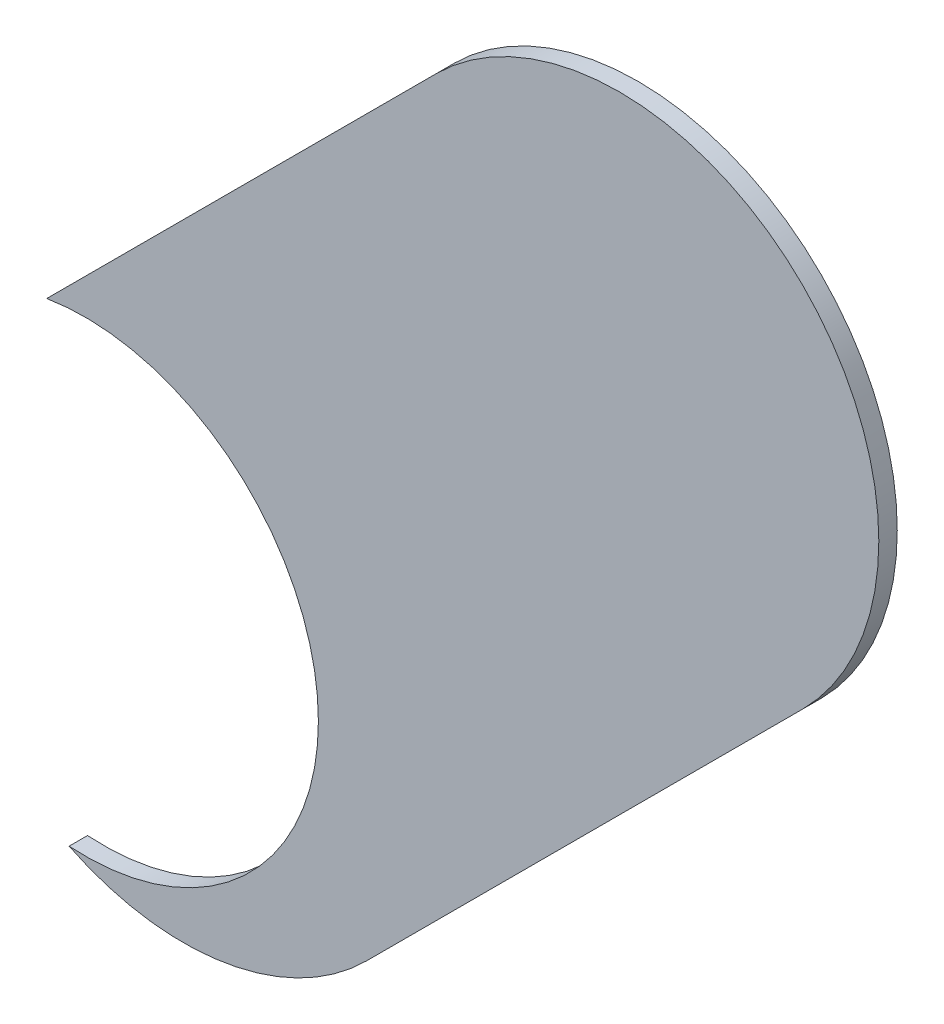
ISO-10303-21;
HEADER;
FILE_DESCRIPTION(('STEP AP214'),'2;1');
FILE_NAME('part.step','',(''),(''),'','','');
FILE_SCHEMA(('AUTOMOTIVE_DESIGN { 1 0 10303 214 1 1 1 1 }'));
ENDSEC;
DATA;
#1=APPLICATION_CONTEXT('core data for automotive mechanical design processes');
#2=APPLICATION_PROTOCOL_DEFINITION('international standard','automotive_design',2000,#1);
#3=PRODUCT_CONTEXT('',#1,'mechanical');
#4=PRODUCT('Part','Part','',(#3));
#5=PRODUCT_RELATED_PRODUCT_CATEGORY('part','',(#4));
#6=PRODUCT_DEFINITION_FORMATION('','',#4);
#7=PRODUCT_DEFINITION_CONTEXT('part definition',#1,'design');
#8=PRODUCT_DEFINITION('design','',#6,#7);
#9=PRODUCT_DEFINITION_SHAPE('','',#8);
#10=(LENGTH_UNIT() NAMED_UNIT(*) SI_UNIT(.MILLI.,.METRE.));
#11=(NAMED_UNIT(*) PLANE_ANGLE_UNIT() SI_UNIT($,.RADIAN.));
#12=(NAMED_UNIT(*) SI_UNIT($,.STERADIAN.) SOLID_ANGLE_UNIT());
#13=UNCERTAINTY_MEASURE_WITH_UNIT(LENGTH_MEASURE(1.E-05),#10,'distance_accuracy_value','');
#14=(GEOMETRIC_REPRESENTATION_CONTEXT(3) GLOBAL_UNCERTAINTY_ASSIGNED_CONTEXT((#13)) GLOBAL_UNIT_ASSIGNED_CONTEXT((#10,
#11,#12)) REPRESENTATION_CONTEXT('',''));
#15=CARTESIAN_POINT('',(0.,0.,0.));
#16=DIRECTION('',(0.,0.,1.));
#17=DIRECTION('',(1.,0.,0.));
#18=AXIS2_PLACEMENT_3D('',#15,#16,#17);
#19=CARTESIAN_POINT('',(80.44298872,79.80645964,0.));
#20=DIRECTION('',(-0.70710678118656,0.707106781186536,0.));
#21=DIRECTION('',(0.707106781186536,0.70710678118656,0.));
#22=AXIS2_PLACEMENT_3D('',#19,#20,#21);
#23=PLANE('',#22);
#24=DIRECTION('',(0.707106781186536,0.70710678118656,0.));
#25=VECTOR('',#24,1.);
#26=CARTESIAN_POINT('',(80.44298872,79.80645964,0.03556));
#27=LINE('',#26,#25);
#28=CARTESIAN_POINT('',(80.44298872,79.80645964,0.03556));
#29=VERTEX_POINT('',#28);
#30=CARTESIAN_POINT('',(81.28403352,80.64750444,0.03556));
#31=VERTEX_POINT('',#30);
#32=EDGE_CURVE('E11',#29,#31,#27,.T.);
#33=ORIENTED_EDGE('',*,*,#32,.F.);
#34=DIRECTION('',(0.,0.,1.));
#35=VECTOR('',#34,1.);
#36=CARTESIAN_POINT('',(80.44298872,79.80645964,0.));
#37=LINE('',#36,#35);
#38=CARTESIAN_POINT('',(80.44298872,79.80645964,0.));
#39=VERTEX_POINT('',#38);
#40=EDGE_CURVE('E24',#39,#29,#37,.T.);
#41=ORIENTED_EDGE('',*,*,#40,.F.);
#42=DIRECTION('',(0.707106781186536,0.70710678118656,0.));
#43=VECTOR('',#42,1.);
#44=CARTESIAN_POINT('',(80.44298872,79.80645964,0.));
#45=LINE('',#44,#43);
#46=CARTESIAN_POINT('',(81.28403352,80.64750444,0.));
#47=VERTEX_POINT('',#46);
#48=EDGE_CURVE('E89',#39,#47,#45,.T.);
#49=ORIENTED_EDGE('',*,*,#48,.T.);
#50=DIRECTION('',(0.,0.,1.));
#51=VECTOR('',#50,1.);
#52=CARTESIAN_POINT('',(81.28403352,80.64750444,0.));
#53=LINE('',#52,#51);
#54=EDGE_CURVE('E37',#47,#31,#53,.T.);
#55=ORIENTED_EDGE('',*,*,#54,.T.);
#56=EDGE_LOOP('',(#33,#41,#49,#55));
#57=FACE_BOUND('',#56,.T.);
#58=ADVANCED_FACE('F17',(#57),#23,.F.);
#59=CARTESIAN_POINT('',(80.93048076,81.0010572,0.));
#60=DIRECTION('',(0.,0.,-1.));
#61=DIRECTION('',(0.707106781186562,-0.707106781186533,0.));
#62=AXIS2_PLACEMENT_3D('',#59,#60,#61);
#63=CYLINDRICAL_SURFACE('',#62,0.499999108206436);
#64=CARTESIAN_POINT('',(80.93048076,81.0010572,0.03556));
#65=DIRECTION('',(0.,0.,1.));
#66=DIRECTION('',(0.707106781186562,-0.707106781186533,0.));
#67=AXIS2_PLACEMENT_3D('',#64,#65,#66);
#68=CIRCLE('',#67,0.499999108206436);
#69=CARTESIAN_POINT('',(80.576928,81.35460996,0.03556));
#70=VERTEX_POINT('',#69);
#71=EDGE_CURVE('E111',#31,#70,#68,.T.);
#72=ORIENTED_EDGE('',*,*,#71,.F.);
#73=ORIENTED_EDGE('',*,*,#54,.F.);
#74=CARTESIAN_POINT('',(80.93048076,81.0010572,0.));
#75=DIRECTION('',(0.,0.,1.));
#76=DIRECTION('',(0.707106781186562,-0.707106781186533,0.));
#77=AXIS2_PLACEMENT_3D('',#74,#75,#76);
#78=CIRCLE('',#77,0.499999108206436);
#79=CARTESIAN_POINT('',(80.576928,81.35460996,0.));
#80=VERTEX_POINT('',#79);
#81=EDGE_CURVE('E108',#47,#80,#78,.T.);
#82=ORIENTED_EDGE('',*,*,#81,.T.);
#83=DIRECTION('',(0.,0.,1.));
#84=VECTOR('',#83,1.);
#85=CARTESIAN_POINT('',(80.576928,81.35460996,0.));
#86=LINE('',#85,#84);
#87=EDGE_CURVE('E106',#80,#70,#86,.T.);
#88=ORIENTED_EDGE('',*,*,#87,.T.);
#89=EDGE_LOOP('',(#72,#73,#82,#88));
#90=FACE_BOUND('',#89,.T.);
#91=ADVANCED_FACE('F118',(#90),#63,.T.);
#92=CARTESIAN_POINT('',(80.576928,81.35460996,0.));
#93=DIRECTION('',(0.707106781186542,-0.707106781186554,0.));
#94=DIRECTION('',(-0.707106781186554,-0.707106781186542,0.));
#95=AXIS2_PLACEMENT_3D('',#92,#93,#94);
#96=PLANE('',#95);
#97=DIRECTION('',(-0.707106781186554,-0.707106781186542,0.));
#98=VECTOR('',#97,1.);
#99=CARTESIAN_POINT('',(80.576928,81.35460996,0.03556));
#100=LINE('',#99,#98);
#101=CARTESIAN_POINT('',(79.8262404042577,80.6039223642577,0.03556));
#102=VERTEX_POINT('',#101);
#103=EDGE_CURVE('E103',#70,#102,#100,.T.);
#104=ORIENTED_EDGE('',*,*,#103,.F.);
#105=ORIENTED_EDGE('',*,*,#87,.F.);
#106=DIRECTION('',(-0.707106781186554,-0.707106781186542,0.));
#107=VECTOR('',#106,1.);
#108=CARTESIAN_POINT('',(80.576928,81.35460996,0.));
#109=LINE('',#108,#107);
#110=CARTESIAN_POINT('',(79.8262404042577,80.6039223642577,0.));
#111=VERTEX_POINT('',#110);
#112=EDGE_CURVE('E100',#80,#111,#109,.T.);
#113=ORIENTED_EDGE('',*,*,#112,.T.);
#114=DIRECTION('',(0.,0.,1.));
#115=VECTOR('',#114,1.);
#116=CARTESIAN_POINT('',(79.8262404042577,80.6039223642577,0.));
#117=LINE('',#116,#115);
#118=EDGE_CURVE('E98',#111,#102,#117,.T.);
#119=ORIENTED_EDGE('',*,*,#118,.T.);
#120=EDGE_LOOP('',(#104,#105,#113,#119));
#121=FACE_BOUND('',#120,.T.);
#122=ADVANCED_FACE('F124',(#121),#96,.F.);
#123=CARTESIAN_POINT('',(79.900018,80.1600124,0.));
#124=DIRECTION('',(0.,0.,-1.));
#125=DIRECTION('',(1.,0.,0.));
#126=AXIS2_PLACEMENT_3D('',#123,#124,#125);
#127=CYLINDRICAL_SURFACE('',#126,0.4499991);
#128=DIRECTION('',(0.,0.,1.));
#129=VECTOR('',#128,1.);
#130=CARTESIAN_POINT('',(80.3500171,80.1600124,0.));
#131=LINE('',#130,#129);
#132=CARTESIAN_POINT('',(80.3500171,80.1600124,0.));
#133=VERTEX_POINT('',#132);
#134=CARTESIAN_POINT('',(80.3500171,80.1600124,0.03556));
#135=VERTEX_POINT('',#134);
#136=EDGE_CURVE('E81',#133,#135,#131,.T.);
#137=ORIENTED_EDGE('',*,*,#136,.T.);
#138=CARTESIAN_POINT('',(79.900018,80.1600124,0.03556));
#139=DIRECTION('',(0.,0.,1.));
#140=DIRECTION('',(1.,0.,0.));
#141=AXIS2_PLACEMENT_3D('',#138,#139,#140);
#142=CIRCLE('',#141,0.4499991);
#143=EDGE_CURVE('E94',#135,#102,#142,.T.);
#144=ORIENTED_EDGE('',*,*,#143,.T.);
#145=ORIENTED_EDGE('',*,*,#118,.F.);
#146=CARTESIAN_POINT('',(79.900018,80.1600124,0.));
#147=DIRECTION('',(0.,0.,1.));
#148=DIRECTION('',(1.,0.,0.));
#149=AXIS2_PLACEMENT_3D('',#146,#147,#148);
#150=CIRCLE('',#149,0.4499991);
#151=EDGE_CURVE('E75',#133,#111,#150,.T.);
#152=ORIENTED_EDGE('',*,*,#151,.F.);
#153=EDGE_LOOP('',(#137,#144,#145,#152));
#154=FACE_BOUND('',#153,.T.);
#155=ADVANCED_FACE('F126',(#154),#127,.F.);
#156=CARTESIAN_POINT('',(79.900018,80.1600124,0.));
#157=DIRECTION('',(0.,0.,-1.));
#158=DIRECTION('',(1.,0.,0.));
#159=AXIS2_PLACEMENT_3D('',#156,#157,#158);
#160=CYLINDRICAL_SURFACE('',#159,0.4499991);
#161=DIRECTION('',(0.,0.,1.));
#162=VECTOR('',#161,1.);
#163=CARTESIAN_POINT('',(79.8693430982223,79.7110600190043,0.));
#164=LINE('',#163,#162);
#165=CARTESIAN_POINT('',(79.8693430982223,79.7110600190043,0.));
#166=VERTEX_POINT('',#165);
#167=CARTESIAN_POINT('',(79.8693430982223,79.7110600190043,0.03556));
#168=VERTEX_POINT('',#167);
#169=EDGE_CURVE('E65',#166,#168,#164,.T.);
#170=ORIENTED_EDGE('',*,*,#169,.T.);
#171=CARTESIAN_POINT('',(79.900018,80.1600124,0.03556));
#172=DIRECTION('',(0.,0.,1.));
#173=DIRECTION('',(1.,0.,0.));
#174=AXIS2_PLACEMENT_3D('',#171,#172,#173);
#175=CIRCLE('',#174,0.4499991);
#176=EDGE_CURVE('E76',#168,#135,#175,.T.);
#177=ORIENTED_EDGE('',*,*,#176,.T.);
#178=ORIENTED_EDGE('',*,*,#136,.F.);
#179=EDGE_CURVE('E79',#166,#133,#150,.T.);
#180=ORIENTED_EDGE('',*,*,#179,.F.);
#181=EDGE_LOOP('',(#170,#177,#178,#180));
#182=FACE_BOUND('',#181,.T.);
#183=ADVANCED_FACE('F80',(#182),#160,.F.);
#184=CARTESIAN_POINT('',(80.08943596,80.1600124,0.));
#185=DIRECTION('',(0.,0.,-1.));
#186=DIRECTION('',(-0.707106781186562,0.707106781186533,0.));
#187=AXIS2_PLACEMENT_3D('',#184,#185,#186);
#188=CYLINDRICAL_SURFACE('',#187,0.499999108206453);
#189=CARTESIAN_POINT('',(80.08943596,80.1600124,0.03556));
#190=DIRECTION('',(0.,0.,1.));
#191=DIRECTION('',(-0.707106781186562,0.707106781186533,0.));
#192=AXIS2_PLACEMENT_3D('',#189,#190,#191);
#193=CIRCLE('',#192,0.499999108206453);
#194=EDGE_CURVE('E71',#168,#29,#193,.T.);
#195=ORIENTED_EDGE('',*,*,#194,.F.);
#196=ORIENTED_EDGE('',*,*,#169,.F.);
#197=CARTESIAN_POINT('',(80.08943596,80.1600124,0.));
#198=DIRECTION('',(0.,0.,1.));
#199=DIRECTION('',(-0.707106781186562,0.707106781186533,0.));
#200=AXIS2_PLACEMENT_3D('',#197,#198,#199);
#201=CIRCLE('',#200,0.499999108206453);
#202=EDGE_CURVE('E69',#166,#39,#201,.T.);
#203=ORIENTED_EDGE('',*,*,#202,.T.);
#204=ORIENTED_EDGE('',*,*,#40,.T.);
#205=EDGE_LOOP('',(#195,#196,#203,#204));
#206=FACE_BOUND('',#205,.T.);
#207=ADVANCED_FACE('F67',(#206),#188,.T.);
#208=CARTESIAN_POINT('',(80.44298872,79.80645964,0.));
#209=DIRECTION('',(0.,0.,-1.));
#210=DIRECTION('',(-1.,0.,0.));
#211=AXIS2_PLACEMENT_3D('',#208,#209,#210);
#212=PLANE('',#211);
#213=ORIENTED_EDGE('',*,*,#48,.F.);
#214=ORIENTED_EDGE('',*,*,#202,.F.);
#215=ORIENTED_EDGE('',*,*,#179,.T.);
#216=ORIENTED_EDGE('',*,*,#151,.T.);
#217=ORIENTED_EDGE('',*,*,#112,.F.);
#218=ORIENTED_EDGE('',*,*,#81,.F.);
#219=EDGE_LOOP('',(#213,#214,#215,#216,#217,#218));
#220=FACE_BOUND('',#219,.T.);
#221=ADVANCED_FACE('F87',(#220),#212,.T.);
#222=CARTESIAN_POINT('',(80.44298872,79.80645964,0.03556));
#223=DIRECTION('',(0.,0.,-1.));
#224=DIRECTION('',(-1.,0.,0.));
#225=AXIS2_PLACEMENT_3D('',#222,#223,#224);
#226=PLANE('',#225);
#227=ORIENTED_EDGE('',*,*,#194,.T.);
#228=ORIENTED_EDGE('',*,*,#32,.T.);
#229=ORIENTED_EDGE('',*,*,#71,.T.);
#230=ORIENTED_EDGE('',*,*,#103,.T.);
#231=ORIENTED_EDGE('',*,*,#143,.F.);
#232=ORIENTED_EDGE('',*,*,#176,.F.);
#233=EDGE_LOOP('',(#227,#228,#229,#230,#231,#232));
#234=FACE_BOUND('',#233,.T.);
#235=ADVANCED_FACE('F121',(#234),#226,.F.);
#236=CLOSED_SHELL('',(#58,#91,#122,#155,#183,#207,#221,#235));
#237=MANIFOLD_SOLID_BREP('B1',#236);
#238=ADVANCED_BREP_SHAPE_REPRESENTATION('',(#18,#237),#14);
#239=SHAPE_DEFINITION_REPRESENTATION(#9,#238);
ENDSEC;
END-ISO-10303-21;
